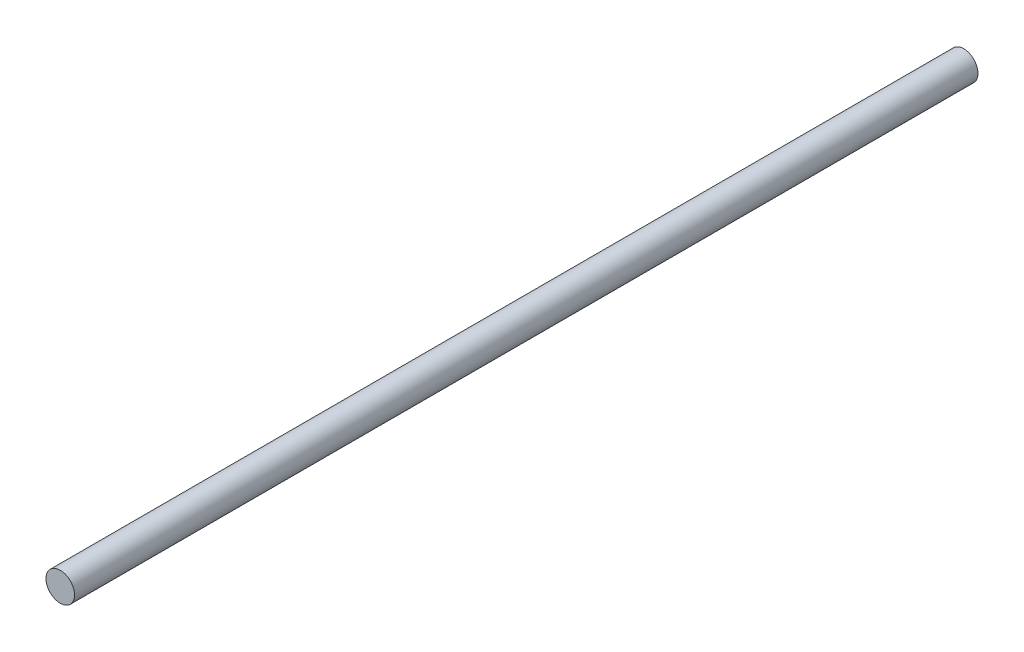
ISO-10303-21;
HEADER;
FILE_DESCRIPTION(('STEP AP214'),'2;1');
FILE_NAME('part.step','',(''),(''),'','','');
FILE_SCHEMA(('AUTOMOTIVE_DESIGN { 1 0 10303 214 1 1 1 1 }'));
ENDSEC;
DATA;
#1=APPLICATION_CONTEXT('core data for automotive mechanical design processes');
#2=APPLICATION_PROTOCOL_DEFINITION('international standard','automotive_design',2000,#1);
#3=PRODUCT_CONTEXT('',#1,'mechanical');
#4=PRODUCT('Part','Part','',(#3));
#5=PRODUCT_RELATED_PRODUCT_CATEGORY('part','',(#4));
#6=PRODUCT_DEFINITION_FORMATION('','',#4);
#7=PRODUCT_DEFINITION_CONTEXT('part definition',#1,'design');
#8=PRODUCT_DEFINITION('design','',#6,#7);
#9=PRODUCT_DEFINITION_SHAPE('','',#8);
#10=(LENGTH_UNIT() NAMED_UNIT(*) SI_UNIT(.MILLI.,.METRE.));
#11=(NAMED_UNIT(*) PLANE_ANGLE_UNIT() SI_UNIT($,.RADIAN.));
#12=(NAMED_UNIT(*) SI_UNIT($,.STERADIAN.) SOLID_ANGLE_UNIT());
#13=UNCERTAINTY_MEASURE_WITH_UNIT(LENGTH_MEASURE(1.E-05),#10,'distance_accuracy_value','');
#14=(GEOMETRIC_REPRESENTATION_CONTEXT(3) GLOBAL_UNCERTAINTY_ASSIGNED_CONTEXT((#13)) GLOBAL_UNIT_ASSIGNED_CONTEXT((#10,
#11,#12)) REPRESENTATION_CONTEXT('',''));
#15=CARTESIAN_POINT('',(0.,0.,0.));
#16=DIRECTION('',(0.,0.,1.));
#17=DIRECTION('',(1.,0.,0.));
#18=AXIS2_PLACEMENT_3D('',#15,#16,#17);
#19=CARTESIAN_POINT('',(0.,0.,158.));
#20=DIRECTION('',(0.,0.,-1.));
#21=DIRECTION('',(-1.,0.,0.));
#22=AXIS2_PLACEMENT_3D('',#19,#20,#21);
#23=CYLINDRICAL_SURFACE('',#22,2.5);
#24=CARTESIAN_POINT('',(0.,0.,158.));
#25=DIRECTION('',(0.,0.,1.));
#26=DIRECTION('',(1.,0.,0.));
#27=AXIS2_PLACEMENT_3D('',#24,#25,#26);
#28=CIRCLE('',#27,2.5);
#29=CARTESIAN_POINT('',(2.5,0.,158.));
#30=VERTEX_POINT('',#29);
#31=EDGE_CURVE('E10',#30,#30,#28,.T.);
#32=ORIENTED_EDGE('',*,*,#31,.F.);
#33=EDGE_LOOP('',(#32));
#34=FACE_BOUND('',#33,.T.);
#35=CARTESIAN_POINT('',(0.,0.,0.));
#36=DIRECTION('',(0.,0.,1.));
#37=DIRECTION('',(1.,0.,0.));
#38=AXIS2_PLACEMENT_3D('',#35,#36,#37);
#39=CIRCLE('',#38,2.5);
#40=CARTESIAN_POINT('',(2.5,0.,0.));
#41=VERTEX_POINT('',#40);
#42=EDGE_CURVE('E32',#41,#41,#39,.T.);
#43=ORIENTED_EDGE('',*,*,#42,.T.);
#44=EDGE_LOOP('',(#43));
#45=FACE_BOUND('',#44,.T.);
#46=ADVANCED_FACE('F29',(#34,#45),#23,.T.);
#47=CARTESIAN_POINT('',(0.,0.,158.));
#48=DIRECTION('',(0.,0.,1.));
#49=DIRECTION('',(1.,0.,0.));
#50=AXIS2_PLACEMENT_3D('',#47,#48,#49);
#51=PLANE('',#50);
#52=ORIENTED_EDGE('',*,*,#31,.T.);
#53=EDGE_LOOP('',(#52));
#54=FACE_BOUND('',#53,.T.);
#55=ADVANCED_FACE('F44',(#54),#51,.T.);
#56=CARTESIAN_POINT('',(0.,0.,0.));
#57=DIRECTION('',(0.,0.,1.));
#58=DIRECTION('',(1.,0.,0.));
#59=AXIS2_PLACEMENT_3D('',#56,#57,#58);
#60=PLANE('',#59);
#61=ORIENTED_EDGE('',*,*,#42,.F.);
#62=EDGE_LOOP('',(#61));
#63=FACE_BOUND('',#62,.T.);
#64=ADVANCED_FACE('F42',(#63),#60,.F.);
#65=CLOSED_SHELL('',(#46,#55,#64));
#66=MANIFOLD_SOLID_BREP('B2',#65);
#67=ADVANCED_BREP_SHAPE_REPRESENTATION('',(#18,#66),#14);
#68=SHAPE_DEFINITION_REPRESENTATION(#9,#67);
ENDSEC;
END-ISO-10303-21;
